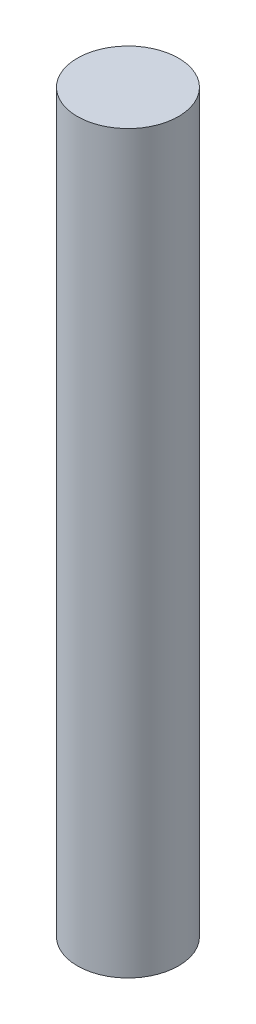
ISO-10303-21;
HEADER;
FILE_DESCRIPTION(('STEP AP214'),'2;1');
FILE_NAME('part.step','',(''),(''),'','','');
FILE_SCHEMA(('AUTOMOTIVE_DESIGN { 1 0 10303 214 1 1 1 1 }'));
ENDSEC;
DATA;
#1=APPLICATION_CONTEXT('core data for automotive mechanical design processes');
#2=APPLICATION_PROTOCOL_DEFINITION('international standard','automotive_design',2000,#1);
#3=PRODUCT_CONTEXT('',#1,'mechanical');
#4=PRODUCT('Part','Part','',(#3));
#5=PRODUCT_RELATED_PRODUCT_CATEGORY('part','',(#4));
#6=PRODUCT_DEFINITION_FORMATION('','',#4);
#7=PRODUCT_DEFINITION_CONTEXT('part definition',#1,'design');
#8=PRODUCT_DEFINITION('design','',#6,#7);
#9=PRODUCT_DEFINITION_SHAPE('','',#8);
#10=(LENGTH_UNIT() NAMED_UNIT(*) SI_UNIT(.MILLI.,.METRE.));
#11=(NAMED_UNIT(*) PLANE_ANGLE_UNIT() SI_UNIT($,.RADIAN.));
#12=(NAMED_UNIT(*) SI_UNIT($,.STERADIAN.) SOLID_ANGLE_UNIT());
#13=UNCERTAINTY_MEASURE_WITH_UNIT(LENGTH_MEASURE(1.E-05),#10,'distance_accuracy_value','');
#14=(GEOMETRIC_REPRESENTATION_CONTEXT(3) GLOBAL_UNCERTAINTY_ASSIGNED_CONTEXT((#13)) GLOBAL_UNIT_ASSIGNED_CONTEXT((#10,
#11,#12)) REPRESENTATION_CONTEXT('',''));
#15=CARTESIAN_POINT('',(0.,0.,0.));
#16=DIRECTION('',(0.,0.,1.));
#17=DIRECTION('',(1.,0.,0.));
#18=AXIS2_PLACEMENT_3D('',#15,#16,#17);
#19=CARTESIAN_POINT('',(0.,43.63,0.));
#20=DIRECTION('',(0.,-1.,0.));
#21=DIRECTION('',(0.,0.,-1.));
#22=AXIS2_PLACEMENT_3D('',#19,#20,#21);
#23=CYLINDRICAL_SURFACE('',#22,6.);
#24=CARTESIAN_POINT('',(0.,43.63,0.));
#25=DIRECTION('',(0.,1.,0.));
#26=DIRECTION('',(0.,0.,1.));
#27=AXIS2_PLACEMENT_3D('',#24,#25,#26);
#28=CIRCLE('',#27,6.);
#29=CARTESIAN_POINT('',(0.,43.63,6.));
#30=VERTEX_POINT('',#29);
#31=EDGE_CURVE('E10',#30,#30,#28,.T.);
#32=ORIENTED_EDGE('',*,*,#31,.F.);
#33=EDGE_LOOP('',(#32));
#34=FACE_BOUND('',#33,.T.);
#35=CARTESIAN_POINT('',(0.,-43.63,0.));
#36=DIRECTION('',(0.,1.,0.));
#37=DIRECTION('',(0.,0.,1.));
#38=AXIS2_PLACEMENT_3D('',#35,#36,#37);
#39=CIRCLE('',#38,6.);
#40=CARTESIAN_POINT('',(0.,-43.63,6.));
#41=VERTEX_POINT('',#40);
#42=EDGE_CURVE('E40',#41,#41,#39,.T.);
#43=ORIENTED_EDGE('',*,*,#42,.T.);
#44=EDGE_LOOP('',(#43));
#45=FACE_BOUND('',#44,.T.);
#46=ADVANCED_FACE('F37',(#34,#45),#23,.T.);
#47=CARTESIAN_POINT('',(0.,43.63,0.));
#48=DIRECTION('',(0.,1.,0.));
#49=DIRECTION('',(0.,0.,1.));
#50=AXIS2_PLACEMENT_3D('',#47,#48,#49);
#51=PLANE('',#50);
#52=ORIENTED_EDGE('',*,*,#31,.T.);
#53=EDGE_LOOP('',(#52));
#54=FACE_BOUND('',#53,.T.);
#55=ADVANCED_FACE('F52',(#54),#51,.T.);
#56=CARTESIAN_POINT('',(0.,-43.63,0.));
#57=DIRECTION('',(0.,1.,0.));
#58=DIRECTION('',(0.,0.,1.));
#59=AXIS2_PLACEMENT_3D('',#56,#57,#58);
#60=PLANE('',#59);
#61=ORIENTED_EDGE('',*,*,#42,.F.);
#62=EDGE_LOOP('',(#61));
#63=FACE_BOUND('',#62,.T.);
#64=ADVANCED_FACE('F50',(#63),#60,.F.);
#65=CLOSED_SHELL('',(#46,#55,#64));
#66=MANIFOLD_SOLID_BREP('B2',#65);
#67=ADVANCED_BREP_SHAPE_REPRESENTATION('',(#18,#66),#14);
#68=SHAPE_DEFINITION_REPRESENTATION(#9,#67);
ENDSEC;
END-ISO-10303-21;
